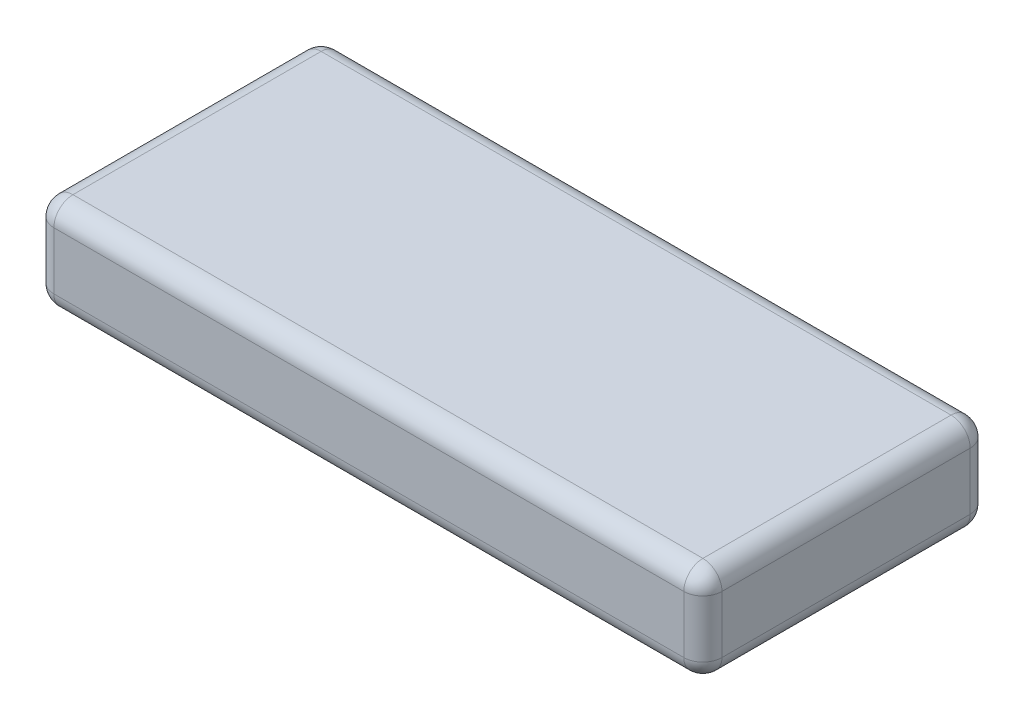
ISO-10303-21;
HEADER;
FILE_DESCRIPTION(('STEP AP214'),'2;1');
FILE_NAME('part.step','',(''),(''),'','','');
FILE_SCHEMA(('AUTOMOTIVE_DESIGN { 1 0 10303 214 1 1 1 1 }'));
ENDSEC;
DATA;
#1=APPLICATION_CONTEXT('core data for automotive mechanical design processes');
#2=APPLICATION_PROTOCOL_DEFINITION('international standard','automotive_design',2000,#1);
#3=PRODUCT_CONTEXT('',#1,'mechanical');
#4=PRODUCT('Part','Part','',(#3));
#5=PRODUCT_RELATED_PRODUCT_CATEGORY('part','',(#4));
#6=PRODUCT_DEFINITION_FORMATION('','',#4);
#7=PRODUCT_DEFINITION_CONTEXT('part definition',#1,'design');
#8=PRODUCT_DEFINITION('design','',#6,#7);
#9=PRODUCT_DEFINITION_SHAPE('','',#8);
#10=(LENGTH_UNIT() NAMED_UNIT(*) SI_UNIT(.MILLI.,.METRE.));
#11=(NAMED_UNIT(*) PLANE_ANGLE_UNIT() SI_UNIT($,.RADIAN.));
#12=(NAMED_UNIT(*) SI_UNIT($,.STERADIAN.) SOLID_ANGLE_UNIT());
#13=UNCERTAINTY_MEASURE_WITH_UNIT(LENGTH_MEASURE(1.E-05),#10,'distance_accuracy_value','');
#14=(GEOMETRIC_REPRESENTATION_CONTEXT(3) GLOBAL_UNCERTAINTY_ASSIGNED_CONTEXT((#13)) GLOBAL_UNIT_ASSIGNED_CONTEXT((#10,
#11,#12)) REPRESENTATION_CONTEXT('',''));
#15=CARTESIAN_POINT('',(0.,0.,0.));
#16=DIRECTION('',(0.,0.,1.));
#17=DIRECTION('',(1.,0.,0.));
#18=AXIS2_PLACEMENT_3D('',#15,#16,#17);
#19=CARTESIAN_POINT('',(35.,10.,-15.));
#20=DIRECTION('',(-1.,0.,0.));
#21=DIRECTION('',(0.,0.,1.));
#22=AXIS2_PLACEMENT_3D('',#19,#20,#21);
#23=PLANE('',#22);
#24=DIRECTION('',(0.,0.,-1.));
#25=VECTOR('',#24,1.);
#26=CARTESIAN_POINT('',(35.,8.,15.));
#27=LINE('',#26,#25);
#28=CARTESIAN_POINT('',(35.,8.,-13.));
#29=VERTEX_POINT('',#28);
#30=CARTESIAN_POINT('',(35.,8.,13.));
#31=VERTEX_POINT('',#30);
#32=EDGE_CURVE('E189',#29,#31,#27,.F.);
#33=ORIENTED_EDGE('',*,*,#32,.T.);
#34=DIRECTION('',(0.,-1.,0.));
#35=VECTOR('',#34,1.);
#36=CARTESIAN_POINT('',(35.,10.,13.));
#37=LINE('',#36,#35);
#38=CARTESIAN_POINT('',(35.,2.,13.));
#39=VERTEX_POINT('',#38);
#40=EDGE_CURVE('E191',#31,#39,#37,.T.);
#41=ORIENTED_EDGE('',*,*,#40,.T.);
#42=DIRECTION('',(0.,0.,-1.));
#43=VECTOR('',#42,1.);
#44=CARTESIAN_POINT('',(35.,2.,-15.));
#45=LINE('',#44,#43);
#46=CARTESIAN_POINT('',(35.,2.,-13.));
#47=VERTEX_POINT('',#46);
#48=EDGE_CURVE('E185',#39,#47,#45,.T.);
#49=ORIENTED_EDGE('',*,*,#48,.T.);
#50=DIRECTION('',(0.,-1.,0.));
#51=VECTOR('',#50,1.);
#52=CARTESIAN_POINT('',(35.,10.,-13.));
#53=LINE('',#52,#51);
#54=EDGE_CURVE('E187',#47,#29,#53,.F.);
#55=ORIENTED_EDGE('',*,*,#54,.T.);
#56=EDGE_LOOP('',(#33,#41,#49,#55));
#57=FACE_BOUND('',#56,.T.);
#58=ADVANCED_FACE('F33',(#57),#23,.F.);
#59=CARTESIAN_POINT('',(-35.,10.,-15.));
#60=DIRECTION('',(0.,0.,1.));
#61=DIRECTION('',(1.,0.,0.));
#62=AXIS2_PLACEMENT_3D('',#59,#60,#61);
#63=PLANE('',#62);
#64=DIRECTION('',(-1.,0.,0.));
#65=VECTOR('',#64,1.);
#66=CARTESIAN_POINT('',(35.,8.,-15.));
#67=LINE('',#66,#65);
#68=CARTESIAN_POINT('',(-33.,8.,-15.));
#69=VERTEX_POINT('',#68);
#70=CARTESIAN_POINT('',(33.,8.,-15.));
#71=VERTEX_POINT('',#70);
#72=EDGE_CURVE('E129',#69,#71,#67,.F.);
#73=ORIENTED_EDGE('',*,*,#72,.T.);
#74=DIRECTION('',(0.,-1.,0.));
#75=VECTOR('',#74,1.);
#76=CARTESIAN_POINT('',(33.,10.,-15.));
#77=LINE('',#76,#75);
#78=CARTESIAN_POINT('',(33.,2.,-15.));
#79=VERTEX_POINT('',#78);
#80=EDGE_CURVE('E165',#71,#79,#77,.T.);
#81=ORIENTED_EDGE('',*,*,#80,.T.);
#82=DIRECTION('',(-1.,0.,0.));
#83=VECTOR('',#82,1.);
#84=CARTESIAN_POINT('',(-35.,2.,-15.));
#85=LINE('',#84,#83);
#86=CARTESIAN_POINT('',(-33.,2.,-15.));
#87=VERTEX_POINT('',#86);
#88=EDGE_CURVE('E162',#79,#87,#85,.T.);
#89=ORIENTED_EDGE('',*,*,#88,.T.);
#90=DIRECTION('',(0.,-1.,0.));
#91=VECTOR('',#90,1.);
#92=CARTESIAN_POINT('',(-33.,10.,-15.));
#93=LINE('',#92,#91);
#94=EDGE_CURVE('E157',#87,#69,#93,.F.);
#95=ORIENTED_EDGE('',*,*,#94,.T.);
#96=EDGE_LOOP('',(#73,#81,#89,#95));
#97=FACE_BOUND('',#96,.T.);
#98=ADVANCED_FACE('F290',(#97),#63,.F.);
#99=CARTESIAN_POINT('',(-35.,10.,-15.));
#100=DIRECTION('',(1.,0.,0.));
#101=DIRECTION('',(0.,0.,-1.));
#102=AXIS2_PLACEMENT_3D('',#99,#100,#101);
#103=PLANE('',#102);
#104=DIRECTION('',(0.,0.,1.));
#105=VECTOR('',#104,1.);
#106=CARTESIAN_POINT('',(-35.,8.,-15.));
#107=LINE('',#106,#105);
#108=CARTESIAN_POINT('',(-35.,8.,13.));
#109=VERTEX_POINT('',#108);
#110=CARTESIAN_POINT('',(-35.,8.,-13.));
#111=VERTEX_POINT('',#110);
#112=EDGE_CURVE('E42',#109,#111,#107,.F.);
#113=ORIENTED_EDGE('',*,*,#112,.T.);
#114=DIRECTION('',(0.,-1.,0.));
#115=VECTOR('',#114,1.);
#116=CARTESIAN_POINT('',(-35.,10.,-13.));
#117=LINE('',#116,#115);
#118=CARTESIAN_POINT('',(-35.,2.,-13.));
#119=VERTEX_POINT('',#118);
#120=EDGE_CURVE('E11',#111,#119,#117,.T.);
#121=ORIENTED_EDGE('',*,*,#120,.T.);
#122=DIRECTION('',(0.,0.,1.));
#123=VECTOR('',#122,1.);
#124=CARTESIAN_POINT('',(-35.,2.,-15.));
#125=LINE('',#124,#123);
#126=CARTESIAN_POINT('',(-35.,2.,13.));
#127=VERTEX_POINT('',#126);
#128=EDGE_CURVE('E194',#119,#127,#125,.T.);
#129=ORIENTED_EDGE('',*,*,#128,.T.);
#130=DIRECTION('',(0.,-1.,0.));
#131=VECTOR('',#130,1.);
#132=CARTESIAN_POINT('',(-35.,10.,13.));
#133=LINE('',#132,#131);
#134=EDGE_CURVE('E53',#127,#109,#133,.F.);
#135=ORIENTED_EDGE('',*,*,#134,.T.);
#136=EDGE_LOOP('',(#113,#121,#129,#135));
#137=FACE_BOUND('',#136,.T.);
#138=ADVANCED_FACE('F296',(#137),#103,.F.);
#139=CARTESIAN_POINT('',(-35.,10.,15.));
#140=DIRECTION('',(0.,0.,-1.));
#141=DIRECTION('',(-1.,0.,0.));
#142=AXIS2_PLACEMENT_3D('',#139,#140,#141);
#143=PLANE('',#142);
#144=DIRECTION('',(1.,0.,0.));
#145=VECTOR('',#144,1.);
#146=CARTESIAN_POINT('',(-35.,2.,15.));
#147=LINE('',#146,#145);
#148=CARTESIAN_POINT('',(-33.,2.,15.));
#149=VERTEX_POINT('',#148);
#150=CARTESIAN_POINT('',(33.,2.,15.));
#151=VERTEX_POINT('',#150);
#152=EDGE_CURVE('E178',#149,#151,#147,.T.);
#153=ORIENTED_EDGE('',*,*,#152,.T.);
#154=DIRECTION('',(0.,-1.,0.));
#155=VECTOR('',#154,1.);
#156=CARTESIAN_POINT('',(33.,10.,15.));
#157=LINE('',#156,#155);
#158=CARTESIAN_POINT('',(33.,8.,15.));
#159=VERTEX_POINT('',#158);
#160=EDGE_CURVE('E183',#151,#159,#157,.F.);
#161=ORIENTED_EDGE('',*,*,#160,.T.);
#162=DIRECTION('',(1.,0.,0.));
#163=VECTOR('',#162,1.);
#164=CARTESIAN_POINT('',(-35.,8.,15.));
#165=LINE('',#164,#163);
#166=CARTESIAN_POINT('',(-33.,8.,15.));
#167=VERTEX_POINT('',#166);
#168=EDGE_CURVE('E180',#159,#167,#165,.F.);
#169=ORIENTED_EDGE('',*,*,#168,.T.);
#170=DIRECTION('',(0.,-1.,0.));
#171=VECTOR('',#170,1.);
#172=CARTESIAN_POINT('',(-33.,10.,15.));
#173=LINE('',#172,#171);
#174=EDGE_CURVE('E176',#167,#149,#173,.T.);
#175=ORIENTED_EDGE('',*,*,#174,.T.);
#176=EDGE_LOOP('',(#153,#161,#169,#175));
#177=FACE_BOUND('',#176,.T.);
#178=ADVANCED_FACE('F313',(#177),#143,.F.);
#179=CARTESIAN_POINT('',(0.,10.,0.));
#180=DIRECTION('',(0.,1.,0.));
#181=DIRECTION('',(0.,0.,1.));
#182=AXIS2_PLACEMENT_3D('',#179,#180,#181);
#183=PLANE('',#182);
#184=DIRECTION('',(1.,0.,0.));
#185=VECTOR('',#184,1.);
#186=CARTESIAN_POINT('',(35.,10.,13.));
#187=LINE('',#186,#185);
#188=CARTESIAN_POINT('',(-33.,10.,13.));
#189=VERTEX_POINT('',#188);
#190=CARTESIAN_POINT('',(33.,10.,13.));
#191=VERTEX_POINT('',#190);
#192=EDGE_CURVE('E150',#189,#191,#187,.T.);
#193=ORIENTED_EDGE('',*,*,#192,.T.);
#194=DIRECTION('',(0.,0.,-1.));
#195=VECTOR('',#194,1.);
#196=CARTESIAN_POINT('',(33.,10.,-15.));
#197=LINE('',#196,#195);
#198=CARTESIAN_POINT('',(33.,10.,-13.));
#199=VERTEX_POINT('',#198);
#200=EDGE_CURVE('E154',#191,#199,#197,.T.);
#201=ORIENTED_EDGE('',*,*,#200,.T.);
#202=DIRECTION('',(-1.,0.,0.));
#203=VECTOR('',#202,1.);
#204=CARTESIAN_POINT('',(-35.,10.,-13.));
#205=LINE('',#204,#203);
#206=CARTESIAN_POINT('',(-33.,10.,-13.));
#207=VERTEX_POINT('',#206);
#208=EDGE_CURVE('E127',#199,#207,#205,.T.);
#209=ORIENTED_EDGE('',*,*,#208,.T.);
#210=DIRECTION('',(0.,0.,1.));
#211=VECTOR('',#210,1.);
#212=CARTESIAN_POINT('',(-33.,10.,15.));
#213=LINE('',#212,#211);
#214=EDGE_CURVE('E144',#207,#189,#213,.T.);
#215=ORIENTED_EDGE('',*,*,#214,.T.);
#216=EDGE_LOOP('',(#193,#201,#209,#215));
#217=FACE_BOUND('',#216,.T.);
#218=ADVANCED_FACE('F152',(#217),#183,.T.);
#219=CARTESIAN_POINT('',(0.,0.,0.));
#220=DIRECTION('',(0.,1.,0.));
#221=DIRECTION('',(0.,0.,1.));
#222=AXIS2_PLACEMENT_3D('',#219,#220,#221);
#223=PLANE('',#222);
#224=DIRECTION('',(-1.,0.,0.));
#225=VECTOR('',#224,1.);
#226=CARTESIAN_POINT('',(0.,0.,-13.));
#227=LINE('',#226,#225);
#228=CARTESIAN_POINT('',(-33.,0.,-13.));
#229=VERTEX_POINT('',#228);
#230=CARTESIAN_POINT('',(33.,0.,-13.));
#231=VERTEX_POINT('',#230);
#232=EDGE_CURVE('E171',#229,#231,#227,.F.);
#233=ORIENTED_EDGE('',*,*,#232,.T.);
#234=DIRECTION('',(0.,0.,-1.));
#235=VECTOR('',#234,1.);
#236=CARTESIAN_POINT('',(33.,0.,0.));
#237=LINE('',#236,#235);
#238=CARTESIAN_POINT('',(33.,0.,13.));
#239=VERTEX_POINT('',#238);
#240=EDGE_CURVE('E174',#231,#239,#237,.F.);
#241=ORIENTED_EDGE('',*,*,#240,.T.);
#242=DIRECTION('',(1.,0.,0.));
#243=VECTOR('',#242,1.);
#244=CARTESIAN_POINT('',(0.,0.,13.));
#245=LINE('',#244,#243);
#246=CARTESIAN_POINT('',(-33.,0.,13.));
#247=VERTEX_POINT('',#246);
#248=EDGE_CURVE('E169',#239,#247,#245,.F.);
#249=ORIENTED_EDGE('',*,*,#248,.T.);
#250=DIRECTION('',(0.,0.,1.));
#251=VECTOR('',#250,1.);
#252=CARTESIAN_POINT('',(-33.,0.,0.));
#253=LINE('',#252,#251);
#254=EDGE_CURVE('E167',#247,#229,#253,.F.);
#255=ORIENTED_EDGE('',*,*,#254,.T.);
#256=EDGE_LOOP('',(#233,#241,#249,#255));
#257=FACE_BOUND('',#256,.T.);
#258=ADVANCED_FACE('F315',(#257),#223,.F.);
#259=CARTESIAN_POINT('',(-35.,2.,13.));
#260=DIRECTION('',(1.,0.,0.));
#261=DIRECTION('',(0.,0.,-1.));
#262=AXIS2_PLACEMENT_3D('',#259,#260,#261);
#263=CYLINDRICAL_SURFACE('',#262,2.);
#264=CARTESIAN_POINT('',(33.,2.,13.));
#265=DIRECTION('',(1.,0.,0.));
#266=DIRECTION('',(0.,0.,-1.));
#267=AXIS2_PLACEMENT_3D('',#264,#265,#266);
#268=CIRCLE('',#267,2.);
#269=EDGE_CURVE('E37',#151,#239,#268,.T.);
#270=ORIENTED_EDGE('',*,*,#269,.F.);
#271=ORIENTED_EDGE('',*,*,#152,.F.);
#272=CARTESIAN_POINT('',(-33.,2.,13.));
#273=DIRECTION('',(-1.,0.,0.));
#274=DIRECTION('',(0.,0.,1.));
#275=AXIS2_PLACEMENT_3D('',#272,#273,#274);
#276=CIRCLE('',#275,2.);
#277=EDGE_CURVE('E247',#247,#149,#276,.T.);
#278=ORIENTED_EDGE('',*,*,#277,.F.);
#279=ORIENTED_EDGE('',*,*,#248,.F.);
#280=EDGE_LOOP('',(#270,#271,#278,#279));
#281=FACE_BOUND('',#280,.T.);
#282=ADVANCED_FACE('F35',(#281),#263,.T.);
#283=CARTESIAN_POINT('',(33.,2.,13.));
#284=DIRECTION('',(0.,-1.,0.));
#285=DIRECTION('',(0.,0.,-1.));
#286=AXIS2_PLACEMENT_3D('',#283,#284,#285);
#287=SPHERICAL_SURFACE('',#286,2.);
#288=CARTESIAN_POINT('',(33.,2.,13.));
#289=DIRECTION('',(0.,-1.,0.));
#290=DIRECTION('',(0.,0.,-1.));
#291=AXIS2_PLACEMENT_3D('',#288,#289,#290);
#292=CIRCLE('',#291,2.);
#293=EDGE_CURVE('E242',#151,#39,#292,.F.);
#294=ORIENTED_EDGE('',*,*,#293,.F.);
#295=ORIENTED_EDGE('',*,*,#269,.T.);
#296=CARTESIAN_POINT('',(33.,2.,13.));
#297=DIRECTION('',(0.,0.,1.));
#298=DIRECTION('',(1.,0.,0.));
#299=AXIS2_PLACEMENT_3D('',#296,#297,#298);
#300=CIRCLE('',#299,2.);
#301=EDGE_CURVE('E245',#39,#239,#300,.F.);
#302=ORIENTED_EDGE('',*,*,#301,.F.);
#303=EDGE_LOOP('',(#294,#295,#302));
#304=FACE_BOUND('',#303,.T.);
#305=ADVANCED_FACE('F258',(#304),#287,.T.);
#306=CARTESIAN_POINT('',(-33.,2.,13.));
#307=DIRECTION('',(0.,0.,1.));
#308=DIRECTION('',(1.,0.,0.));
#309=AXIS2_PLACEMENT_3D('',#306,#307,#308);
#310=SPHERICAL_SURFACE('',#309,2.);
#311=CARTESIAN_POINT('',(-33.,2.,13.));
#312=DIRECTION('',(0.,0.,1.));
#313=DIRECTION('',(1.,0.,0.));
#314=AXIS2_PLACEMENT_3D('',#311,#312,#313);
#315=CIRCLE('',#314,2.);
#316=EDGE_CURVE('E236',#247,#127,#315,.F.);
#317=ORIENTED_EDGE('',*,*,#316,.F.);
#318=ORIENTED_EDGE('',*,*,#277,.T.);
#319=CARTESIAN_POINT('',(-33.,2.,13.));
#320=DIRECTION('',(0.,-1.,0.));
#321=DIRECTION('',(0.,0.,-1.));
#322=AXIS2_PLACEMENT_3D('',#319,#320,#321);
#323=CIRCLE('',#322,2.);
#324=EDGE_CURVE('E239',#127,#149,#323,.F.);
#325=ORIENTED_EDGE('',*,*,#324,.F.);
#326=EDGE_LOOP('',(#317,#318,#325));
#327=FACE_BOUND('',#326,.T.);
#328=ADVANCED_FACE('F302',(#327),#310,.T.);
#329=CARTESIAN_POINT('',(33.,2.,-15.));
#330=DIRECTION('',(0.,0.,-1.));
#331=DIRECTION('',(-1.,0.,0.));
#332=AXIS2_PLACEMENT_3D('',#329,#330,#331);
#333=CYLINDRICAL_SURFACE('',#332,2.);
#334=ORIENTED_EDGE('',*,*,#301,.T.);
#335=ORIENTED_EDGE('',*,*,#240,.F.);
#336=CARTESIAN_POINT('',(33.,2.,-13.));
#337=DIRECTION('',(0.,0.,-1.));
#338=DIRECTION('',(-1.,0.,0.));
#339=AXIS2_PLACEMENT_3D('',#336,#337,#338);
#340=CIRCLE('',#339,2.);
#341=EDGE_CURVE('E231',#47,#231,#340,.T.);
#342=ORIENTED_EDGE('',*,*,#341,.F.);
#343=ORIENTED_EDGE('',*,*,#48,.F.);
#344=EDGE_LOOP('',(#334,#335,#342,#343));
#345=FACE_BOUND('',#344,.T.);
#346=ADVANCED_FACE('F265',(#345),#333,.T.);
#347=CARTESIAN_POINT('',(33.,10.,13.));
#348=DIRECTION('',(0.,-1.,0.));
#349=DIRECTION('',(0.,0.,-1.));
#350=AXIS2_PLACEMENT_3D('',#347,#348,#349);
#351=CYLINDRICAL_SURFACE('',#350,2.);
#352=ORIENTED_EDGE('',*,*,#293,.T.);
#353=ORIENTED_EDGE('',*,*,#40,.F.);
#354=CARTESIAN_POINT('',(33.,8.,13.));
#355=DIRECTION('',(0.,1.,0.));
#356=DIRECTION('',(0.,0.,1.));
#357=AXIS2_PLACEMENT_3D('',#354,#355,#356);
#358=CIRCLE('',#357,2.);
#359=EDGE_CURVE('E228',#159,#31,#358,.T.);
#360=ORIENTED_EDGE('',*,*,#359,.F.);
#361=ORIENTED_EDGE('',*,*,#160,.F.);
#362=EDGE_LOOP('',(#352,#353,#360,#361));
#363=FACE_BOUND('',#362,.T.);
#364=ADVANCED_FACE('F274',(#363),#351,.T.);
#365=CARTESIAN_POINT('',(0.,8.,13.));
#366=DIRECTION('',(-1.,0.,0.));
#367=DIRECTION('',(0.,0.,1.));
#368=AXIS2_PLACEMENT_3D('',#365,#366,#367);
#369=CYLINDRICAL_SURFACE('',#368,2.);
#370=CARTESIAN_POINT('',(-33.,8.,13.));
#371=DIRECTION('',(-1.,0.,0.));
#372=DIRECTION('',(0.,-1.,0.));
#373=AXIS2_PLACEMENT_3D('',#370,#371,#372);
#374=CIRCLE('',#373,2.);
#375=EDGE_CURVE('E222',#167,#189,#374,.T.);
#376=ORIENTED_EDGE('',*,*,#375,.F.);
#377=ORIENTED_EDGE('',*,*,#168,.F.);
#378=CARTESIAN_POINT('',(33.,8.,13.));
#379=DIRECTION('',(1.,0.,0.));
#380=DIRECTION('',(0.,0.,-1.));
#381=AXIS2_PLACEMENT_3D('',#378,#379,#380);
#382=CIRCLE('',#381,2.);
#383=EDGE_CURVE('E225',#191,#159,#382,.T.);
#384=ORIENTED_EDGE('',*,*,#383,.F.);
#385=ORIENTED_EDGE('',*,*,#192,.F.);
#386=EDGE_LOOP('',(#376,#377,#384,#385));
#387=FACE_BOUND('',#386,.T.);
#388=ADVANCED_FACE('F311',(#387),#369,.T.);
#389=CARTESIAN_POINT('',(-33.,10.,13.));
#390=DIRECTION('',(0.,-1.,0.));
#391=DIRECTION('',(0.,0.,-1.));
#392=AXIS2_PLACEMENT_3D('',#389,#390,#391);
#393=CYLINDRICAL_SURFACE('',#392,2.);
#394=ORIENTED_EDGE('',*,*,#324,.T.);
#395=ORIENTED_EDGE('',*,*,#174,.F.);
#396=CARTESIAN_POINT('',(-33.,8.,13.));
#397=DIRECTION('',(0.,1.,0.));
#398=DIRECTION('',(0.,0.,1.));
#399=AXIS2_PLACEMENT_3D('',#396,#397,#398);
#400=CIRCLE('',#399,2.);
#401=EDGE_CURVE('E220',#109,#167,#400,.T.);
#402=ORIENTED_EDGE('',*,*,#401,.F.);
#403=ORIENTED_EDGE('',*,*,#134,.F.);
#404=EDGE_LOOP('',(#394,#395,#402,#403));
#405=FACE_BOUND('',#404,.T.);
#406=ADVANCED_FACE('F305',(#405),#393,.T.);
#407=CARTESIAN_POINT('',(-33.,2.,-15.));
#408=DIRECTION('',(0.,0.,1.));
#409=DIRECTION('',(1.,0.,0.));
#410=AXIS2_PLACEMENT_3D('',#407,#408,#409);
#411=CYLINDRICAL_SURFACE('',#410,2.);
#412=ORIENTED_EDGE('',*,*,#316,.T.);
#413=ORIENTED_EDGE('',*,*,#128,.F.);
#414=CARTESIAN_POINT('',(-33.,2.,-13.));
#415=DIRECTION('',(0.,0.,-1.));
#416=DIRECTION('',(-1.,0.,0.));
#417=AXIS2_PLACEMENT_3D('',#414,#415,#416);
#418=CIRCLE('',#417,2.);
#419=EDGE_CURVE('E217',#229,#119,#418,.T.);
#420=ORIENTED_EDGE('',*,*,#419,.F.);
#421=ORIENTED_EDGE('',*,*,#254,.F.);
#422=EDGE_LOOP('',(#412,#413,#420,#421));
#423=FACE_BOUND('',#422,.T.);
#424=ADVANCED_FACE('F301',(#423),#411,.T.);
#425=CARTESIAN_POINT('',(-35.,2.,-13.));
#426=DIRECTION('',(-1.,0.,0.));
#427=DIRECTION('',(0.,0.,1.));
#428=AXIS2_PLACEMENT_3D('',#425,#426,#427);
#429=CYLINDRICAL_SURFACE('',#428,2.);
#430=CARTESIAN_POINT('',(33.,2.,-13.));
#431=DIRECTION('',(1.,0.,0.));
#432=DIRECTION('',(0.,0.,-1.));
#433=AXIS2_PLACEMENT_3D('',#430,#431,#432);
#434=CIRCLE('',#433,2.);
#435=EDGE_CURVE('E233',#231,#79,#434,.T.);
#436=ORIENTED_EDGE('',*,*,#435,.F.);
#437=ORIENTED_EDGE('',*,*,#232,.F.);
#438=CARTESIAN_POINT('',(-33.,2.,-13.));
#439=DIRECTION('',(-1.,0.,0.));
#440=DIRECTION('',(0.,0.,1.));
#441=AXIS2_PLACEMENT_3D('',#438,#439,#440);
#442=CIRCLE('',#441,2.);
#443=EDGE_CURVE('E214',#87,#229,#442,.T.);
#444=ORIENTED_EDGE('',*,*,#443,.F.);
#445=ORIENTED_EDGE('',*,*,#88,.F.);
#446=EDGE_LOOP('',(#436,#437,#444,#445));
#447=FACE_BOUND('',#446,.T.);
#448=ADVANCED_FACE('F319',(#447),#429,.T.);
#449=CARTESIAN_POINT('',(33.,2.,-13.));
#450=DIRECTION('',(0.,-1.,0.));
#451=DIRECTION('',(0.,0.,-1.));
#452=AXIS2_PLACEMENT_3D('',#449,#450,#451);
#453=SPHERICAL_SURFACE('',#452,2.);
#454=ORIENTED_EDGE('',*,*,#341,.T.);
#455=ORIENTED_EDGE('',*,*,#435,.T.);
#456=CARTESIAN_POINT('',(33.,2.,-13.));
#457=DIRECTION('',(0.,-1.,0.));
#458=DIRECTION('',(0.,0.,-1.));
#459=AXIS2_PLACEMENT_3D('',#456,#457,#458);
#460=CIRCLE('',#459,2.);
#461=EDGE_CURVE('E211',#47,#79,#460,.F.);
#462=ORIENTED_EDGE('',*,*,#461,.F.);
#463=EDGE_LOOP('',(#454,#455,#462));
#464=FACE_BOUND('',#463,.T.);
#465=ADVANCED_FACE('F406',(#464),#453,.T.);
#466=CARTESIAN_POINT('',(33.,8.,13.));
#467=DIRECTION('',(0.,0.,1.));
#468=DIRECTION('',(1.,0.,0.));
#469=AXIS2_PLACEMENT_3D('',#466,#467,#468);
#470=SPHERICAL_SURFACE('',#469,2.);
#471=ORIENTED_EDGE('',*,*,#383,.T.);
#472=ORIENTED_EDGE('',*,*,#359,.T.);
#473=CARTESIAN_POINT('',(33.,8.,13.));
#474=DIRECTION('',(0.,0.,1.));
#475=DIRECTION('',(1.,0.,0.));
#476=AXIS2_PLACEMENT_3D('',#473,#474,#475);
#477=CIRCLE('',#476,2.);
#478=EDGE_CURVE('E208',#191,#31,#477,.F.);
#479=ORIENTED_EDGE('',*,*,#478,.F.);
#480=EDGE_LOOP('',(#471,#472,#479));
#481=FACE_BOUND('',#480,.T.);
#482=ADVANCED_FACE('F277',(#481),#470,.T.);
#483=CARTESIAN_POINT('',(-33.,8.,13.));
#484=DIRECTION('',(0.,0.,1.));
#485=DIRECTION('',(1.,0.,0.));
#486=AXIS2_PLACEMENT_3D('',#483,#484,#485);
#487=SPHERICAL_SURFACE('',#486,2.);
#488=ORIENTED_EDGE('',*,*,#401,.T.);
#489=ORIENTED_EDGE('',*,*,#375,.T.);
#490=CARTESIAN_POINT('',(-33.,8.,13.));
#491=DIRECTION('',(0.,0.,1.));
#492=DIRECTION('',(1.,0.,0.));
#493=AXIS2_PLACEMENT_3D('',#490,#491,#492);
#494=CIRCLE('',#493,2.);
#495=EDGE_CURVE('E147',#109,#189,#494,.F.);
#496=ORIENTED_EDGE('',*,*,#495,.F.);
#497=EDGE_LOOP('',(#488,#489,#496));
#498=FACE_BOUND('',#497,.T.);
#499=ADVANCED_FACE('F308',(#498),#487,.T.);
#500=CARTESIAN_POINT('',(-33.,2.,-13.));
#501=DIRECTION('',(0.,-1.,0.));
#502=DIRECTION('',(0.,0.,-1.));
#503=AXIS2_PLACEMENT_3D('',#500,#501,#502);
#504=SPHERICAL_SURFACE('',#503,2.);
#505=ORIENTED_EDGE('',*,*,#443,.T.);
#506=ORIENTED_EDGE('',*,*,#419,.T.);
#507=CARTESIAN_POINT('',(-33.,2.,-13.));
#508=DIRECTION('',(0.,-1.,0.));
#509=DIRECTION('',(0.,0.,-1.));
#510=AXIS2_PLACEMENT_3D('',#507,#508,#509);
#511=CIRCLE('',#510,2.);
#512=EDGE_CURVE('E205',#87,#119,#511,.F.);
#513=ORIENTED_EDGE('',*,*,#512,.F.);
#514=EDGE_LOOP('',(#505,#506,#513));
#515=FACE_BOUND('',#514,.T.);
#516=ADVANCED_FACE('F321',(#515),#504,.T.);
#517=CARTESIAN_POINT('',(33.,10.,-13.));
#518=DIRECTION('',(0.,-1.,0.));
#519=DIRECTION('',(0.,0.,-1.));
#520=AXIS2_PLACEMENT_3D('',#517,#518,#519);
#521=CYLINDRICAL_SURFACE('',#520,2.);
#522=ORIENTED_EDGE('',*,*,#461,.T.);
#523=ORIENTED_EDGE('',*,*,#80,.F.);
#524=CARTESIAN_POINT('',(33.,8.,-13.));
#525=DIRECTION('',(0.,1.,0.));
#526=DIRECTION('',(0.,0.,1.));
#527=AXIS2_PLACEMENT_3D('',#524,#525,#526);
#528=CIRCLE('',#527,2.);
#529=EDGE_CURVE('E202',#29,#71,#528,.T.);
#530=ORIENTED_EDGE('',*,*,#529,.F.);
#531=ORIENTED_EDGE('',*,*,#54,.F.);
#532=EDGE_LOOP('',(#522,#523,#530,#531));
#533=FACE_BOUND('',#532,.T.);
#534=ADVANCED_FACE('F287',(#533),#521,.T.);
#535=CARTESIAN_POINT('',(33.,8.,0.));
#536=DIRECTION('',(0.,0.,1.));
#537=DIRECTION('',(1.,0.,0.));
#538=AXIS2_PLACEMENT_3D('',#535,#536,#537);
#539=CYLINDRICAL_SURFACE('',#538,2.);
#540=ORIENTED_EDGE('',*,*,#478,.T.);
#541=ORIENTED_EDGE('',*,*,#32,.F.);
#542=CARTESIAN_POINT('',(33.,8.,-13.));
#543=DIRECTION('',(0.,0.,-1.));
#544=DIRECTION('',(-1.,0.,0.));
#545=AXIS2_PLACEMENT_3D('',#542,#543,#544);
#546=CIRCLE('',#545,2.);
#547=EDGE_CURVE('E141',#199,#29,#546,.T.);
#548=ORIENTED_EDGE('',*,*,#547,.F.);
#549=ORIENTED_EDGE('',*,*,#200,.F.);
#550=EDGE_LOOP('',(#540,#541,#548,#549));
#551=FACE_BOUND('',#550,.T.);
#552=ADVANCED_FACE('F280',(#551),#539,.T.);
#553=CARTESIAN_POINT('',(-33.,8.,0.));
#554=DIRECTION('',(0.,0.,-1.));
#555=DIRECTION('',(-1.,0.,0.));
#556=AXIS2_PLACEMENT_3D('',#553,#554,#555);
#557=CYLINDRICAL_SURFACE('',#556,2.);
#558=ORIENTED_EDGE('',*,*,#495,.T.);
#559=ORIENTED_EDGE('',*,*,#214,.F.);
#560=CARTESIAN_POINT('',(-33.,8.,-13.));
#561=DIRECTION('',(0.,0.,-1.));
#562=DIRECTION('',(-1.,0.,0.));
#563=AXIS2_PLACEMENT_3D('',#560,#561,#562);
#564=CIRCLE('',#563,2.);
#565=EDGE_CURVE('E135',#111,#207,#564,.T.);
#566=ORIENTED_EDGE('',*,*,#565,.F.);
#567=ORIENTED_EDGE('',*,*,#112,.F.);
#568=EDGE_LOOP('',(#558,#559,#566,#567));
#569=FACE_BOUND('',#568,.T.);
#570=ADVANCED_FACE('F145',(#569),#557,.T.);
#571=CARTESIAN_POINT('',(-33.,10.,-13.));
#572=DIRECTION('',(0.,-1.,0.));
#573=DIRECTION('',(0.,0.,-1.));
#574=AXIS2_PLACEMENT_3D('',#571,#572,#573);
#575=CYLINDRICAL_SURFACE('',#574,2.);
#576=ORIENTED_EDGE('',*,*,#512,.T.);
#577=ORIENTED_EDGE('',*,*,#120,.F.);
#578=CARTESIAN_POINT('',(-33.,8.,-13.));
#579=DIRECTION('',(0.,1.,0.));
#580=DIRECTION('',(0.,0.,1.));
#581=AXIS2_PLACEMENT_3D('',#578,#579,#580);
#582=CIRCLE('',#581,2.);
#583=EDGE_CURVE('E139',#69,#111,#582,.T.);
#584=ORIENTED_EDGE('',*,*,#583,.F.);
#585=ORIENTED_EDGE('',*,*,#94,.F.);
#586=EDGE_LOOP('',(#576,#577,#584,#585));
#587=FACE_BOUND('',#586,.T.);
#588=ADVANCED_FACE('F294',(#587),#575,.T.);
#589=CARTESIAN_POINT('',(33.,8.,-13.));
#590=DIRECTION('',(1.,0.,0.));
#591=DIRECTION('',(0.,0.,-1.));
#592=AXIS2_PLACEMENT_3D('',#589,#590,#591);
#593=SPHERICAL_SURFACE('',#592,2.);
#594=ORIENTED_EDGE('',*,*,#547,.T.);
#595=ORIENTED_EDGE('',*,*,#529,.T.);
#596=CARTESIAN_POINT('',(33.,8.,-13.));
#597=DIRECTION('',(1.,0.,0.));
#598=DIRECTION('',(0.,0.,-1.));
#599=AXIS2_PLACEMENT_3D('',#596,#597,#598);
#600=CIRCLE('',#599,2.);
#601=EDGE_CURVE('E132',#199,#71,#600,.F.);
#602=ORIENTED_EDGE('',*,*,#601,.F.);
#603=EDGE_LOOP('',(#594,#595,#602));
#604=FACE_BOUND('',#603,.T.);
#605=ADVANCED_FACE('F284',(#604),#593,.T.);
#606=CARTESIAN_POINT('',(-33.,8.,-13.));
#607=DIRECTION('',(-1.,0.,0.));
#608=DIRECTION('',(0.,0.,1.));
#609=AXIS2_PLACEMENT_3D('',#606,#607,#608);
#610=SPHERICAL_SURFACE('',#609,2.);
#611=ORIENTED_EDGE('',*,*,#583,.T.);
#612=ORIENTED_EDGE('',*,*,#565,.T.);
#613=CARTESIAN_POINT('',(-33.,8.,-13.));
#614=DIRECTION('',(-1.,0.,0.));
#615=DIRECTION('',(0.,0.,1.));
#616=AXIS2_PLACEMENT_3D('',#613,#614,#615);
#617=CIRCLE('',#616,2.);
#618=EDGE_CURVE('E123',#69,#207,#617,.F.);
#619=ORIENTED_EDGE('',*,*,#618,.F.);
#620=EDGE_LOOP('',(#611,#612,#619));
#621=FACE_BOUND('',#620,.T.);
#622=ADVANCED_FACE('F137',(#621),#610,.T.);
#623=CARTESIAN_POINT('',(0.,8.,-13.));
#624=DIRECTION('',(1.,0.,0.));
#625=DIRECTION('',(0.,0.,-1.));
#626=AXIS2_PLACEMENT_3D('',#623,#624,#625);
#627=CYLINDRICAL_SURFACE('',#626,2.);
#628=ORIENTED_EDGE('',*,*,#601,.T.);
#629=ORIENTED_EDGE('',*,*,#72,.F.);
#630=ORIENTED_EDGE('',*,*,#618,.T.);
#631=ORIENTED_EDGE('',*,*,#208,.F.);
#632=EDGE_LOOP('',(#628,#629,#630,#631));
#633=FACE_BOUND('',#632,.T.);
#634=ADVANCED_FACE('F125',(#633),#627,.T.);
#635=CLOSED_SHELL('',(#58,#98,#138,#178,#218,#258,#282,#305,#328,#346,#364,#388,#406,#424,#448,
#465,#482,#499,#516,#534,#552,#570,#588,#605,#622,#634));
#636=MANIFOLD_SOLID_BREP('B2',#635);
#637=ADVANCED_BREP_SHAPE_REPRESENTATION('',(#18,#636),#14);
#638=SHAPE_DEFINITION_REPRESENTATION(#9,#637);
ENDSEC;
END-ISO-10303-21;
